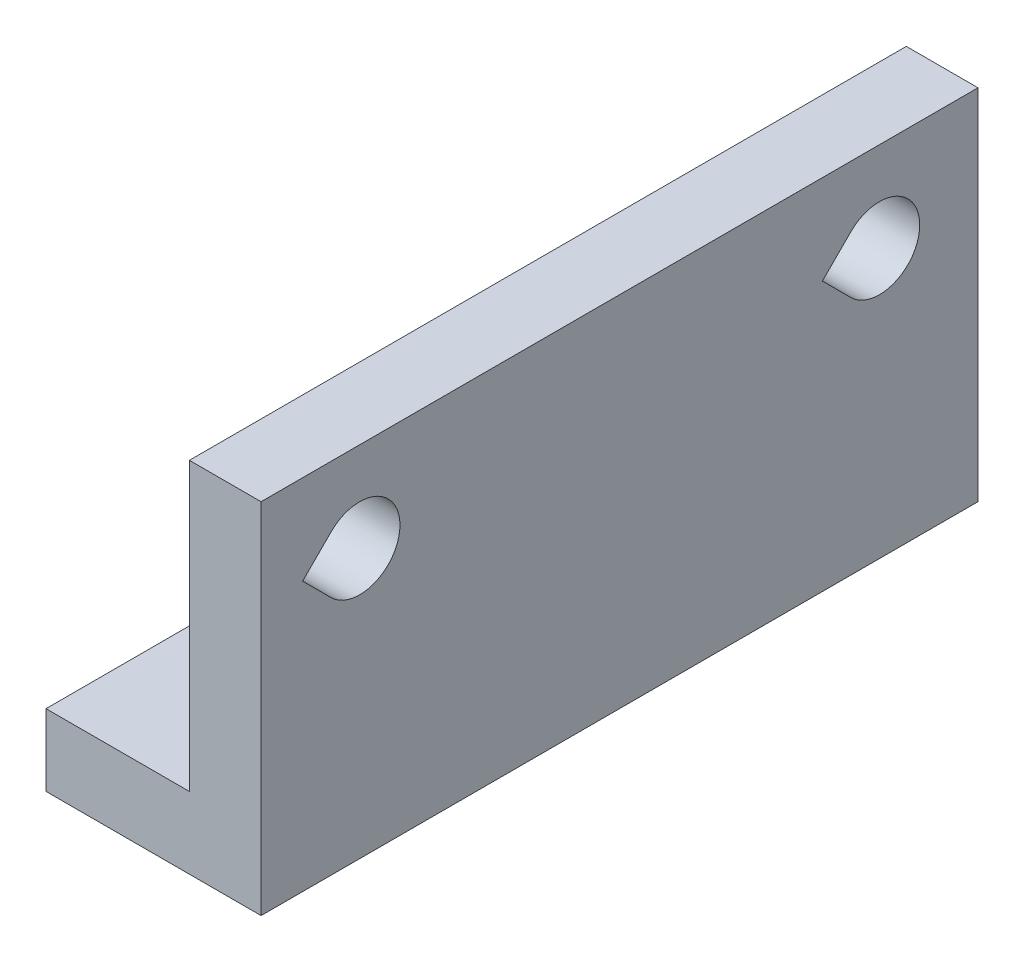
ISO-10303-21;
HEADER;
FILE_DESCRIPTION(('STEP AP214'),'2;1');
FILE_NAME('part.step','',(''),(''),'','','');
FILE_SCHEMA(('AUTOMOTIVE_DESIGN { 1 0 10303 214 1 1 1 1 }'));
ENDSEC;
DATA;
#1=APPLICATION_CONTEXT('core data for automotive mechanical design processes');
#2=APPLICATION_PROTOCOL_DEFINITION('international standard','automotive_design',2000,#1);
#3=PRODUCT_CONTEXT('',#1,'mechanical');
#4=PRODUCT('Part','Part','',(#3));
#5=PRODUCT_RELATED_PRODUCT_CATEGORY('part','',(#4));
#6=PRODUCT_DEFINITION_FORMATION('','',#4);
#7=PRODUCT_DEFINITION_CONTEXT('part definition',#1,'design');
#8=PRODUCT_DEFINITION('design','',#6,#7);
#9=PRODUCT_DEFINITION_SHAPE('','',#8);
#10=(LENGTH_UNIT() NAMED_UNIT(*) SI_UNIT(.MILLI.,.METRE.));
#11=(NAMED_UNIT(*) PLANE_ANGLE_UNIT() SI_UNIT($,.RADIAN.));
#12=(NAMED_UNIT(*) SI_UNIT($,.STERADIAN.) SOLID_ANGLE_UNIT());
#13=UNCERTAINTY_MEASURE_WITH_UNIT(LENGTH_MEASURE(1.E-05),#10,'distance_accuracy_value','');
#14=(GEOMETRIC_REPRESENTATION_CONTEXT(3) GLOBAL_UNCERTAINTY_ASSIGNED_CONTEXT((#13)) GLOBAL_UNIT_ASSIGNED_CONTEXT((#10,
#11,#12)) REPRESENTATION_CONTEXT('',''));
#15=CARTESIAN_POINT('',(0.,0.,0.));
#16=DIRECTION('',(0.,0.,1.));
#17=DIRECTION('',(1.,0.,0.));
#18=AXIS2_PLACEMENT_3D('',#15,#16,#17);
#19=CARTESIAN_POINT('',(-15.,0.,40.));
#20=DIRECTION('',(0.,1.,0.));
#21=DIRECTION('',(0.,0.,1.));
#22=AXIS2_PLACEMENT_3D('',#19,#20,#21);
#23=PLANE('',#22);
#24=DIRECTION('',(0.707106781186548,0.,-0.707106781186547));
#25=VECTOR('',#24,1.);
#26=CARTESIAN_POINT('',(-11.,0.,15.1819805153395));
#27=LINE('',#26,#25);
#28=CARTESIAN_POINT('',(-11.,0.,15.1819805153395));
#29=VERTEX_POINT('',#28);
#30=CARTESIAN_POINT('',(-9.40900974233027,0.,13.5909902576697));
#31=VERTEX_POINT('',#30);
#32=EDGE_CURVE('E223',#29,#31,#27,.T.);
#33=ORIENTED_EDGE('',*,*,#32,.T.);
#34=CARTESIAN_POINT('',(-11.,0.,12.));
#35=DIRECTION('',(0.,1.,0.));
#36=DIRECTION('',(0.,0.,1.));
#37=AXIS2_PLACEMENT_3D('',#34,#35,#36);
#38=CIRCLE('',#37,2.25);
#39=CARTESIAN_POINT('',(-12.5909902576697,0.,13.5909902576697));
#40=VERTEX_POINT('',#39);
#41=EDGE_CURVE('E226',#31,#40,#38,.T.);
#42=ORIENTED_EDGE('',*,*,#41,.T.);
#43=DIRECTION('',(0.707106781186547,0.,0.707106781186548));
#44=VECTOR('',#43,1.);
#45=CARTESIAN_POINT('',(-12.5909902576697,0.,13.5909902576697));
#46=LINE('',#45,#44);
#47=EDGE_CURVE('E227',#40,#29,#46,.T.);
#48=ORIENTED_EDGE('',*,*,#47,.T.);
#49=EDGE_LOOP('',(#33,#42,#48));
#50=FACE_BOUND('',#49,.T.);
#51=DIRECTION('',(1.,0.,0.));
#52=VECTOR('',#51,1.);
#53=CARTESIAN_POINT('',(-15.,0.,0.));
#54=LINE('',#53,#52);
#55=CARTESIAN_POINT('',(-15.,0.,0.));
#56=VERTEX_POINT('',#55);
#57=CARTESIAN_POINT('',(-3.,0.,0.));
#58=VERTEX_POINT('',#57);
#59=EDGE_CURVE('E230',#56,#58,#54,.T.);
#60=ORIENTED_EDGE('',*,*,#59,.T.);
#61=DIRECTION('',(0.,0.,1.));
#62=VECTOR('',#61,1.);
#63=CARTESIAN_POINT('',(-3.,0.,0.));
#64=LINE('',#63,#62);
#65=CARTESIAN_POINT('',(-3.,0.,40.));
#66=VERTEX_POINT('',#65);
#67=EDGE_CURVE('E174',#58,#66,#64,.T.);
#68=ORIENTED_EDGE('',*,*,#67,.T.);
#69=DIRECTION('',(1.,0.,0.));
#70=VECTOR('',#69,1.);
#71=CARTESIAN_POINT('',(-15.,0.,40.));
#72=LINE('',#71,#70);
#73=CARTESIAN_POINT('',(-15.,0.,40.));
#74=VERTEX_POINT('',#73);
#75=EDGE_CURVE('E198',#74,#66,#72,.T.);
#76=ORIENTED_EDGE('',*,*,#75,.F.);
#77=DIRECTION('',(0.,0.,-1.));
#78=VECTOR('',#77,1.);
#79=CARTESIAN_POINT('',(-15.,0.,40.));
#80=LINE('',#79,#78);
#81=EDGE_CURVE('E170',#74,#56,#80,.T.);
#82=ORIENTED_EDGE('',*,*,#81,.T.);
#83=EDGE_LOOP('',(#60,#68,#76,#82));
#84=FACE_BOUND('',#83,.T.);
#85=ADVANCED_FACE('F32',(#50,#84),#23,.F.);
#86=CARTESIAN_POINT('',(0.,0.,40.));
#87=DIRECTION('',(0.,0.,1.));
#88=DIRECTION('',(1.,0.,0.));
#89=AXIS2_PLACEMENT_3D('',#86,#87,#88);
#90=PLANE('',#89);
#91=DIRECTION('',(0.,1.,0.));
#92=VECTOR('',#91,1.);
#93=CARTESIAN_POINT('',(-3.,0.,40.));
#94=LINE('',#93,#92);
#95=CARTESIAN_POINT('',(-3.,20.,40.));
#96=VERTEX_POINT('',#95);
#97=EDGE_CURVE('E173',#66,#96,#94,.T.);
#98=ORIENTED_EDGE('',*,*,#97,.T.);
#99=DIRECTION('',(-1.,0.,0.));
#100=VECTOR('',#99,1.);
#101=CARTESIAN_POINT('',(-3.,20.,40.));
#102=LINE('',#101,#100);
#103=CARTESIAN_POINT('',(-7.,20.,40.));
#104=VERTEX_POINT('',#103);
#105=EDGE_CURVE('E204',#96,#104,#102,.T.);
#106=ORIENTED_EDGE('',*,*,#105,.T.);
#107=DIRECTION('',(0.,-1.,0.));
#108=VECTOR('',#107,1.);
#109=CARTESIAN_POINT('',(-7.,20.,40.));
#110=LINE('',#109,#108);
#111=CARTESIAN_POINT('',(-7.,4.,40.));
#112=VERTEX_POINT('',#111);
#113=EDGE_CURVE('E202',#104,#112,#110,.T.);
#114=ORIENTED_EDGE('',*,*,#113,.T.);
#115=DIRECTION('',(-1.,0.,0.));
#116=VECTOR('',#115,1.);
#117=CARTESIAN_POINT('',(-7.,4.,40.));
#118=LINE('',#117,#116);
#119=CARTESIAN_POINT('',(-15.,4.,40.));
#120=VERTEX_POINT('',#119);
#121=EDGE_CURVE('E199',#112,#120,#118,.T.);
#122=ORIENTED_EDGE('',*,*,#121,.T.);
#123=DIRECTION('',(0.,-1.,0.));
#124=VECTOR('',#123,1.);
#125=CARTESIAN_POINT('',(-15.,4.,40.));
#126=LINE('',#125,#124);
#127=EDGE_CURVE('E201',#120,#74,#126,.T.);
#128=ORIENTED_EDGE('',*,*,#127,.T.);
#129=ORIENTED_EDGE('',*,*,#75,.T.);
#130=EDGE_LOOP('',(#98,#106,#114,#122,#128,#129));
#131=FACE_BOUND('',#130,.T.);
#132=ADVANCED_FACE('F285',(#131),#90,.T.);
#133=CARTESIAN_POINT('',(0.,0.,0.));
#134=DIRECTION('',(0.,0.,1.));
#135=DIRECTION('',(1.,0.,0.));
#136=AXIS2_PLACEMENT_3D('',#133,#134,#135);
#137=PLANE('',#136);
#138=DIRECTION('',(0.,1.,0.));
#139=VECTOR('',#138,1.);
#140=CARTESIAN_POINT('',(-3.,4.,0.));
#141=LINE('',#140,#139);
#142=CARTESIAN_POINT('',(-3.,20.,0.));
#143=VERTEX_POINT('',#142);
#144=EDGE_CURVE('E49',#58,#143,#141,.T.);
#145=ORIENTED_EDGE('',*,*,#144,.F.);
#146=ORIENTED_EDGE('',*,*,#59,.F.);
#147=DIRECTION('',(0.,-1.,0.));
#148=VECTOR('',#147,1.);
#149=CARTESIAN_POINT('',(-15.,4.,0.));
#150=LINE('',#149,#148);
#151=CARTESIAN_POINT('',(-15.,4.,0.));
#152=VERTEX_POINT('',#151);
#153=EDGE_CURVE('E190',#152,#56,#150,.T.);
#154=ORIENTED_EDGE('',*,*,#153,.F.);
#155=DIRECTION('',(-1.,0.,0.));
#156=VECTOR('',#155,1.);
#157=CARTESIAN_POINT('',(-7.,4.,0.));
#158=LINE('',#157,#156);
#159=CARTESIAN_POINT('',(-7.,4.,0.));
#160=VERTEX_POINT('',#159);
#161=EDGE_CURVE('E181',#160,#152,#158,.T.);
#162=ORIENTED_EDGE('',*,*,#161,.F.);
#163=DIRECTION('',(0.,-1.,0.));
#164=VECTOR('',#163,1.);
#165=CARTESIAN_POINT('',(-7.,20.,0.));
#166=LINE('',#165,#164);
#167=CARTESIAN_POINT('',(-7.,20.,0.));
#168=VERTEX_POINT('',#167);
#169=EDGE_CURVE('E169',#168,#160,#166,.T.);
#170=ORIENTED_EDGE('',*,*,#169,.F.);
#171=DIRECTION('',(-1.,0.,0.));
#172=VECTOR('',#171,1.);
#173=CARTESIAN_POINT('',(-3.,20.,0.));
#174=LINE('',#173,#172);
#175=EDGE_CURVE('E177',#143,#168,#174,.T.);
#176=ORIENTED_EDGE('',*,*,#175,.F.);
#177=EDGE_LOOP('',(#145,#146,#154,#162,#170,#176));
#178=FACE_BOUND('',#177,.T.);
#179=ADVANCED_FACE('F273',(#178),#137,.F.);
#180=CARTESIAN_POINT('',(-15.,4.,40.));
#181=DIRECTION('',(1.,0.,0.));
#182=DIRECTION('',(0.,0.,-1.));
#183=AXIS2_PLACEMENT_3D('',#180,#181,#182);
#184=PLANE('',#183);
#185=ORIENTED_EDGE('',*,*,#153,.T.);
#186=ORIENTED_EDGE('',*,*,#81,.F.);
#187=ORIENTED_EDGE('',*,*,#127,.F.);
#188=DIRECTION('',(0.,0.,-1.));
#189=VECTOR('',#188,1.);
#190=CARTESIAN_POINT('',(-15.,4.,40.));
#191=LINE('',#190,#189);
#192=EDGE_CURVE('E186',#120,#152,#191,.T.);
#193=ORIENTED_EDGE('',*,*,#192,.T.);
#194=EDGE_LOOP('',(#185,#186,#187,#193));
#195=FACE_BOUND('',#194,.T.);
#196=ADVANCED_FACE('F265',(#195),#184,.F.);
#197=CARTESIAN_POINT('',(-3.,4.,40.));
#198=DIRECTION('',(-1.,0.,0.));
#199=DIRECTION('',(0.,-1.,0.));
#200=AXIS2_PLACEMENT_3D('',#197,#198,#199);
#201=PLANE('',#200);
#202=DIRECTION('',(0.,0.707106781186547,-0.707106781186548));
#203=VECTOR('',#202,1.);
#204=CARTESIAN_POINT('',(-3.,8.34099025766975,44.3409902576697));
#205=LINE('',#204,#203);
#206=CARTESIAN_POINT('',(-3.,15.,37.6819805153395));
#207=VERTEX_POINT('',#206);
#208=CARTESIAN_POINT('',(-3.,16.5909902576697,36.0909902576697));
#209=VERTEX_POINT('',#208);
#210=EDGE_CURVE('E189',#207,#209,#205,.T.);
#211=ORIENTED_EDGE('',*,*,#210,.T.);
#212=CARTESIAN_POINT('',(-3.,15.,34.5));
#213=DIRECTION('',(-1.,0.,0.));
#214=DIRECTION('',(0.,-1.,0.));
#215=AXIS2_PLACEMENT_3D('',#212,#213,#214);
#216=CIRCLE('',#215,2.25);
#217=CARTESIAN_POINT('',(-3.,13.4090097423303,36.0909902576697));
#218=VERTEX_POINT('',#217);
#219=EDGE_CURVE('E151',#209,#218,#216,.T.);
#220=ORIENTED_EDGE('',*,*,#219,.T.);
#221=DIRECTION('',(0.,0.707106781186547,0.707106781186548));
#222=VECTOR('',#221,1.);
#223=CARTESIAN_POINT('',(-3.,10.6590097423303,33.3409902576697));
#224=LINE('',#223,#222);
#225=EDGE_CURVE('E241',#218,#207,#224,.T.);
#226=ORIENTED_EDGE('',*,*,#225,.T.);
#227=EDGE_LOOP('',(#211,#220,#226));
#228=FACE_BOUND('',#227,.T.);
#229=DIRECTION('',(0.,0.707106781186547,-0.707106781186548));
#230=VECTOR('',#229,1.);
#231=CARTESIAN_POINT('',(-3.,-6.15900974233025,29.8409902576698));
#232=LINE('',#231,#230);
#233=CARTESIAN_POINT('',(-3.,15.,8.68198051533946));
#234=VERTEX_POINT('',#233);
#235=CARTESIAN_POINT('',(-3.,16.5909902576697,7.09099025766973));
#236=VERTEX_POINT('',#235);
#237=EDGE_CURVE('E236',#234,#236,#232,.T.);
#238=ORIENTED_EDGE('',*,*,#237,.T.);
#239=CARTESIAN_POINT('',(-3.,15.,5.5));
#240=DIRECTION('',(-1.,0.,0.));
#241=DIRECTION('',(0.,-1.,0.));
#242=AXIS2_PLACEMENT_3D('',#239,#240,#241);
#243=CIRCLE('',#242,2.25);
#244=CARTESIAN_POINT('',(-3.,13.4090097423303,7.09099025766973));
#245=VERTEX_POINT('',#244);
#246=EDGE_CURVE('E233',#236,#245,#243,.T.);
#247=ORIENTED_EDGE('',*,*,#246,.T.);
#248=DIRECTION('',(0.,0.707106781186547,0.707106781186548));
#249=VECTOR('',#248,1.);
#250=CARTESIAN_POINT('',(-3.,25.1590097423303,18.8409902576698));
#251=LINE('',#250,#249);
#252=EDGE_CURVE('E195',#245,#234,#251,.T.);
#253=ORIENTED_EDGE('',*,*,#252,.T.);
#254=EDGE_LOOP('',(#238,#247,#253));
#255=FACE_BOUND('',#254,.T.);
#256=ORIENTED_EDGE('',*,*,#144,.T.);
#257=DIRECTION('',(0.,0.,-1.));
#258=VECTOR('',#257,1.);
#259=CARTESIAN_POINT('',(-3.,20.,40.));
#260=LINE('',#259,#258);
#261=EDGE_CURVE('E158',#96,#143,#260,.T.);
#262=ORIENTED_EDGE('',*,*,#261,.F.);
#263=ORIENTED_EDGE('',*,*,#97,.F.);
#264=ORIENTED_EDGE('',*,*,#67,.F.);
#265=EDGE_LOOP('',(#256,#262,#263,#264));
#266=FACE_BOUND('',#265,.T.);
#267=ADVANCED_FACE('F261',(#228,#255,#266),#201,.F.);
#268=CARTESIAN_POINT('',(-3.,20.,40.));
#269=DIRECTION('',(0.,-1.,0.));
#270=DIRECTION('',(0.,0.,-1.));
#271=AXIS2_PLACEMENT_3D('',#268,#269,#270);
#272=PLANE('',#271);
#273=ORIENTED_EDGE('',*,*,#175,.T.);
#274=DIRECTION('',(0.,0.,-1.));
#275=VECTOR('',#274,1.);
#276=CARTESIAN_POINT('',(-7.,20.,40.));
#277=LINE('',#276,#275);
#278=EDGE_CURVE('E178',#104,#168,#277,.T.);
#279=ORIENTED_EDGE('',*,*,#278,.F.);
#280=ORIENTED_EDGE('',*,*,#105,.F.);
#281=ORIENTED_EDGE('',*,*,#261,.T.);
#282=EDGE_LOOP('',(#273,#279,#280,#281));
#283=FACE_BOUND('',#282,.T.);
#284=ADVANCED_FACE('F264',(#283),#272,.F.);
#285=CARTESIAN_POINT('',(-7.,20.,40.));
#286=DIRECTION('',(1.,0.,0.));
#287=DIRECTION('',(0.,1.,0.));
#288=AXIS2_PLACEMENT_3D('',#285,#286,#287);
#289=PLANE('',#288);
#290=DIRECTION('',(0.,-0.707106781186547,-0.707106781186548));
#291=VECTOR('',#290,1.);
#292=CARTESIAN_POINT('',(-7.,18.6590097423303,41.3409902576697));
#293=LINE('',#292,#291);
#294=CARTESIAN_POINT('',(-7.,15.,37.6819805153395));
#295=VERTEX_POINT('',#294);
#296=CARTESIAN_POINT('',(-7.,13.4090097423303,36.0909902576697));
#297=VERTEX_POINT('',#296);
#298=EDGE_CURVE('E156',#295,#297,#293,.T.);
#299=ORIENTED_EDGE('',*,*,#298,.T.);
#300=CARTESIAN_POINT('',(-7.,15.,34.5));
#301=DIRECTION('',(1.,0.,0.));
#302=DIRECTION('',(0.,1.,0.));
#303=AXIS2_PLACEMENT_3D('',#300,#301,#302);
#304=CIRCLE('',#303,2.25);
#305=CARTESIAN_POINT('',(-7.,16.5909902576697,36.0909902576697));
#306=VERTEX_POINT('',#305);
#307=EDGE_CURVE('E145',#297,#306,#304,.T.);
#308=ORIENTED_EDGE('',*,*,#307,.T.);
#309=DIRECTION('',(0.,-0.707106781186547,0.707106781186548));
#310=VECTOR('',#309,1.);
#311=CARTESIAN_POINT('',(-7.,16.3409902576697,36.3409902576697));
#312=LINE('',#311,#310);
#313=EDGE_CURVE('E135',#306,#295,#312,.T.);
#314=ORIENTED_EDGE('',*,*,#313,.T.);
#315=EDGE_LOOP('',(#299,#308,#314));
#316=FACE_BOUND('',#315,.T.);
#317=DIRECTION('',(0.,-0.707106781186547,-0.707106781186548));
#318=VECTOR('',#317,1.);
#319=CARTESIAN_POINT('',(-7.,33.1590097423303,26.8409902576698));
#320=LINE('',#319,#318);
#321=CARTESIAN_POINT('',(-7.,15.,8.68198051533946));
#322=VERTEX_POINT('',#321);
#323=CARTESIAN_POINT('',(-7.,13.4090097423303,7.09099025766973));
#324=VERTEX_POINT('',#323);
#325=EDGE_CURVE('E144',#322,#324,#320,.T.);
#326=ORIENTED_EDGE('',*,*,#325,.T.);
#327=CARTESIAN_POINT('',(-7.,15.,5.5));
#328=DIRECTION('',(1.,0.,0.));
#329=DIRECTION('',(0.,1.,0.));
#330=AXIS2_PLACEMENT_3D('',#327,#328,#329);
#331=CIRCLE('',#330,2.25);
#332=CARTESIAN_POINT('',(-7.,16.5909902576697,7.09099025766973));
#333=VERTEX_POINT('',#332);
#334=EDGE_CURVE('E161',#324,#333,#331,.T.);
#335=ORIENTED_EDGE('',*,*,#334,.T.);
#336=DIRECTION('',(0.,-0.707106781186547,0.707106781186548));
#337=VECTOR('',#336,1.);
#338=CARTESIAN_POINT('',(-7.,1.84099025766973,21.8409902576698));
#339=LINE('',#338,#337);
#340=EDGE_CURVE('E164',#333,#322,#339,.T.);
#341=ORIENTED_EDGE('',*,*,#340,.T.);
#342=EDGE_LOOP('',(#326,#335,#341));
#343=FACE_BOUND('',#342,.T.);
#344=ORIENTED_EDGE('',*,*,#169,.T.);
#345=DIRECTION('',(0.,0.,-1.));
#346=VECTOR('',#345,1.);
#347=CARTESIAN_POINT('',(-7.,4.,40.));
#348=LINE('',#347,#346);
#349=EDGE_CURVE('E182',#112,#160,#348,.T.);
#350=ORIENTED_EDGE('',*,*,#349,.F.);
#351=ORIENTED_EDGE('',*,*,#113,.F.);
#352=ORIENTED_EDGE('',*,*,#278,.T.);
#353=EDGE_LOOP('',(#344,#350,#351,#352));
#354=FACE_BOUND('',#353,.T.);
#355=ADVANCED_FACE('F154',(#316,#343,#354),#289,.F.);
#356=CARTESIAN_POINT('',(-7.,4.,40.));
#357=DIRECTION('',(0.,-1.,0.));
#358=DIRECTION('',(0.,0.,-1.));
#359=AXIS2_PLACEMENT_3D('',#356,#357,#358);
#360=PLANE('',#359);
#361=DIRECTION('',(0.707106781186547,0.,0.707106781186548));
#362=VECTOR('',#361,1.);
#363=CARTESIAN_POINT('',(-12.5909902576697,4.,13.5909902576697));
#364=LINE('',#363,#362);
#365=CARTESIAN_POINT('',(-12.5909902576697,4.,13.5909902576697));
#366=VERTEX_POINT('',#365);
#367=CARTESIAN_POINT('',(-11.,4.,15.1819805153395));
#368=VERTEX_POINT('',#367);
#369=EDGE_CURVE('E212',#366,#368,#364,.T.);
#370=ORIENTED_EDGE('',*,*,#369,.F.);
#371=CARTESIAN_POINT('',(-11.,4.,12.));
#372=DIRECTION('',(0.,1.,0.));
#373=DIRECTION('',(0.,0.,1.));
#374=AXIS2_PLACEMENT_3D('',#371,#372,#373);
#375=CIRCLE('',#374,2.25);
#376=CARTESIAN_POINT('',(-9.40900974233027,4.,13.5909902576697));
#377=VERTEX_POINT('',#376);
#378=EDGE_CURVE('E185',#377,#366,#375,.T.);
#379=ORIENTED_EDGE('',*,*,#378,.F.);
#380=DIRECTION('',(0.707106781186548,0.,-0.707106781186547));
#381=VECTOR('',#380,1.);
#382=CARTESIAN_POINT('',(-11.,4.,15.1819805153395));
#383=LINE('',#382,#381);
#384=EDGE_CURVE('E215',#368,#377,#383,.T.);
#385=ORIENTED_EDGE('',*,*,#384,.F.);
#386=EDGE_LOOP('',(#370,#379,#385));
#387=FACE_BOUND('',#386,.T.);
#388=ORIENTED_EDGE('',*,*,#161,.T.);
#389=ORIENTED_EDGE('',*,*,#192,.F.);
#390=ORIENTED_EDGE('',*,*,#121,.F.);
#391=ORIENTED_EDGE('',*,*,#349,.T.);
#392=EDGE_LOOP('',(#388,#389,#390,#391));
#393=FACE_BOUND('',#392,.T.);
#394=ADVANCED_FACE('F281',(#387,#393),#360,.F.);
#395=CARTESIAN_POINT('',(-11.,0.,12.));
#396=DIRECTION('',(0.,1.,0.));
#397=DIRECTION('',(0.,0.,1.));
#398=AXIS2_PLACEMENT_3D('',#395,#396,#397);
#399=CYLINDRICAL_SURFACE('',#398,2.25);
#400=ORIENTED_EDGE('',*,*,#378,.T.);
#401=DIRECTION('',(0.,1.,0.));
#402=VECTOR('',#401,1.);
#403=CARTESIAN_POINT('',(-12.5909902576697,0.,13.5909902576697));
#404=LINE('',#403,#402);
#405=EDGE_CURVE('E208',#40,#366,#404,.T.);
#406=ORIENTED_EDGE('',*,*,#405,.F.);
#407=ORIENTED_EDGE('',*,*,#41,.F.);
#408=DIRECTION('',(0.,1.,0.));
#409=VECTOR('',#408,1.);
#410=CARTESIAN_POINT('',(-9.40900974233027,0.,13.5909902576697));
#411=LINE('',#410,#409);
#412=EDGE_CURVE('E216',#31,#377,#411,.T.);
#413=ORIENTED_EDGE('',*,*,#412,.T.);
#414=EDGE_LOOP('',(#400,#406,#407,#413));
#415=FACE_BOUND('',#414,.T.);
#416=ADVANCED_FACE('F312',(#415),#399,.F.);
#417=CARTESIAN_POINT('',(-11.,0.,15.1819805153395));
#418=DIRECTION('',(0.707106781186547,0.,0.707106781186548));
#419=DIRECTION('',(0.707106781186548,0.,-0.707106781186547));
#420=AXIS2_PLACEMENT_3D('',#417,#418,#419);
#421=PLANE('',#420);
#422=ORIENTED_EDGE('',*,*,#384,.T.);
#423=ORIENTED_EDGE('',*,*,#412,.F.);
#424=ORIENTED_EDGE('',*,*,#32,.F.);
#425=DIRECTION('',(0.,1.,0.));
#426=VECTOR('',#425,1.);
#427=CARTESIAN_POINT('',(-11.,0.,15.1819805153395));
#428=LINE('',#427,#426);
#429=EDGE_CURVE('E213',#29,#368,#428,.T.);
#430=ORIENTED_EDGE('',*,*,#429,.T.);
#431=EDGE_LOOP('',(#422,#423,#424,#430));
#432=FACE_BOUND('',#431,.T.);
#433=ADVANCED_FACE('F304',(#432),#421,.F.);
#434=CARTESIAN_POINT('',(-12.5909902576697,0.,13.5909902576697));
#435=DIRECTION('',(-0.707106781186548,0.,0.707106781186547));
#436=DIRECTION('',(0.707106781186547,0.,0.707106781186548));
#437=AXIS2_PLACEMENT_3D('',#434,#435,#436);
#438=PLANE('',#437);
#439=ORIENTED_EDGE('',*,*,#369,.T.);
#440=ORIENTED_EDGE('',*,*,#429,.F.);
#441=ORIENTED_EDGE('',*,*,#47,.F.);
#442=ORIENTED_EDGE('',*,*,#405,.T.);
#443=EDGE_LOOP('',(#439,#440,#441,#442));
#444=FACE_BOUND('',#443,.T.);
#445=ADVANCED_FACE('F306',(#444),#438,.F.);
#446=CARTESIAN_POINT('',(-15.,16.5909902576697,7.09099025766973));
#447=DIRECTION('',(0.,0.707106781186548,0.707106781186547));
#448=DIRECTION('',(0.,-0.707106781186547,0.707106781186548));
#449=AXIS2_PLACEMENT_3D('',#446,#447,#448);
#450=PLANE('',#449);
#451=DIRECTION('',(1.,0.,0.));
#452=VECTOR('',#451,1.);
#453=CARTESIAN_POINT('',(-15.,15.,8.68198051533946));
#454=LINE('',#453,#452);
#455=EDGE_CURVE('E255',#322,#234,#454,.T.);
#456=ORIENTED_EDGE('',*,*,#455,.F.);
#457=ORIENTED_EDGE('',*,*,#340,.F.);
#458=DIRECTION('',(1.,0.,0.));
#459=VECTOR('',#458,1.);
#460=CARTESIAN_POINT('',(-15.,16.5909902576697,7.09099025766973));
#461=LINE('',#460,#459);
#462=EDGE_CURVE('E211',#333,#236,#461,.T.);
#463=ORIENTED_EDGE('',*,*,#462,.T.);
#464=ORIENTED_EDGE('',*,*,#237,.F.);
#465=EDGE_LOOP('',(#456,#457,#463,#464));
#466=FACE_BOUND('',#465,.T.);
#467=ADVANCED_FACE('F324',(#466),#450,.F.);
#468=CARTESIAN_POINT('',(-15.,15.,8.68198051533946));
#469=DIRECTION('',(0.,-0.707106781186548,0.707106781186547));
#470=DIRECTION('',(0.,-0.707106781186547,-0.707106781186548));
#471=AXIS2_PLACEMENT_3D('',#468,#469,#470);
#472=PLANE('',#471);
#473=DIRECTION('',(1.,0.,0.));
#474=VECTOR('',#473,1.);
#475=CARTESIAN_POINT('',(-15.,13.4090097423303,7.09099025766973));
#476=LINE('',#475,#474);
#477=EDGE_CURVE('E153',#324,#245,#476,.T.);
#478=ORIENTED_EDGE('',*,*,#477,.F.);
#479=ORIENTED_EDGE('',*,*,#325,.F.);
#480=ORIENTED_EDGE('',*,*,#455,.T.);
#481=ORIENTED_EDGE('',*,*,#252,.F.);
#482=EDGE_LOOP('',(#478,#479,#480,#481));
#483=FACE_BOUND('',#482,.T.);
#484=ADVANCED_FACE('F328',(#483),#472,.F.);
#485=CARTESIAN_POINT('',(-15.,15.,5.5));
#486=DIRECTION('',(1.,0.,0.));
#487=DIRECTION('',(0.,1.,0.));
#488=AXIS2_PLACEMENT_3D('',#485,#486,#487);
#489=CYLINDRICAL_SURFACE('',#488,2.25);
#490=ORIENTED_EDGE('',*,*,#462,.F.);
#491=ORIENTED_EDGE('',*,*,#334,.F.);
#492=ORIENTED_EDGE('',*,*,#477,.T.);
#493=ORIENTED_EDGE('',*,*,#246,.F.);
#494=EDGE_LOOP('',(#490,#491,#492,#493));
#495=FACE_BOUND('',#494,.T.);
#496=ADVANCED_FACE('F330',(#495),#489,.F.);
#497=CARTESIAN_POINT('',(-15.,16.5909902576697,36.0909902576697));
#498=DIRECTION('',(0.,0.707106781186548,0.707106781186547));
#499=DIRECTION('',(0.,-0.707106781186547,0.707106781186548));
#500=AXIS2_PLACEMENT_3D('',#497,#498,#499);
#501=PLANE('',#500);
#502=DIRECTION('',(1.,0.,0.));
#503=VECTOR('',#502,1.);
#504=CARTESIAN_POINT('',(-15.,15.,37.6819805153395));
#505=LINE('',#504,#503);
#506=EDGE_CURVE('E41',#295,#207,#505,.T.);
#507=ORIENTED_EDGE('',*,*,#506,.F.);
#508=ORIENTED_EDGE('',*,*,#313,.F.);
#509=DIRECTION('',(1.,0.,0.));
#510=VECTOR('',#509,1.);
#511=CARTESIAN_POINT('',(-15.,16.5909902576697,36.0909902576697));
#512=LINE('',#511,#510);
#513=EDGE_CURVE('E35',#306,#209,#512,.T.);
#514=ORIENTED_EDGE('',*,*,#513,.T.);
#515=ORIENTED_EDGE('',*,*,#210,.F.);
#516=EDGE_LOOP('',(#507,#508,#514,#515));
#517=FACE_BOUND('',#516,.T.);
#518=ADVANCED_FACE('F137',(#517),#501,.F.);
#519=CARTESIAN_POINT('',(-15.,15.,37.6819805153395));
#520=DIRECTION('',(0.,-0.707106781186548,0.707106781186547));
#521=DIRECTION('',(0.,-0.707106781186547,-0.707106781186548));
#522=AXIS2_PLACEMENT_3D('',#519,#520,#521);
#523=PLANE('',#522);
#524=DIRECTION('',(1.,0.,0.));
#525=VECTOR('',#524,1.);
#526=CARTESIAN_POINT('',(-15.,13.4090097423303,36.0909902576697));
#527=LINE('',#526,#525);
#528=EDGE_CURVE('E11',#297,#218,#527,.T.);
#529=ORIENTED_EDGE('',*,*,#528,.F.);
#530=ORIENTED_EDGE('',*,*,#298,.F.);
#531=ORIENTED_EDGE('',*,*,#506,.T.);
#532=ORIENTED_EDGE('',*,*,#225,.F.);
#533=EDGE_LOOP('',(#529,#530,#531,#532));
#534=FACE_BOUND('',#533,.T.);
#535=ADVANCED_FACE('F259',(#534),#523,.F.);
#536=CARTESIAN_POINT('',(-15.,15.,34.5));
#537=DIRECTION('',(1.,0.,0.));
#538=DIRECTION('',(0.,1.,0.));
#539=AXIS2_PLACEMENT_3D('',#536,#537,#538);
#540=CYLINDRICAL_SURFACE('',#539,2.25);
#541=ORIENTED_EDGE('',*,*,#513,.F.);
#542=ORIENTED_EDGE('',*,*,#307,.F.);
#543=ORIENTED_EDGE('',*,*,#528,.T.);
#544=ORIENTED_EDGE('',*,*,#219,.F.);
#545=EDGE_LOOP('',(#541,#542,#543,#544));
#546=FACE_BOUND('',#545,.T.);
#547=ADVANCED_FACE('F148',(#546),#540,.F.);
#548=CLOSED_SHELL('',(#85,#132,#179,#196,#267,#284,#355,#394,#416,#433,#445,#467,#484,#496,#518,
#535,#547));
#549=MANIFOLD_SOLID_BREP('B2',#548);
#550=ADVANCED_BREP_SHAPE_REPRESENTATION('',(#18,#549),#14);
#551=SHAPE_DEFINITION_REPRESENTATION(#9,#550);
ENDSEC;
END-ISO-10303-21;
